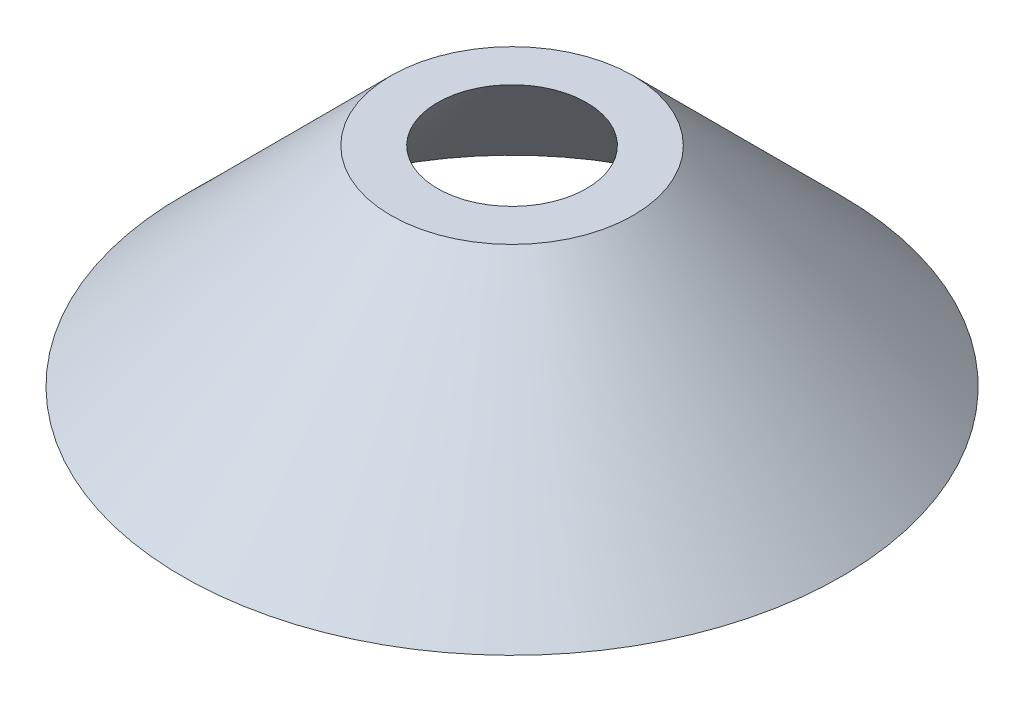
ISO-10303-21;
HEADER;
FILE_DESCRIPTION(('STEP AP214'),'2;1');
FILE_NAME('part.step','',(''),(''),'','','');
FILE_SCHEMA(('AUTOMOTIVE_DESIGN { 1 0 10303 214 1 1 1 1 }'));
ENDSEC;
DATA;
#1=APPLICATION_CONTEXT('core data for automotive mechanical design processes');
#2=APPLICATION_PROTOCOL_DEFINITION('international standard','automotive_design',2000,#1);
#3=PRODUCT_CONTEXT('',#1,'mechanical');
#4=PRODUCT('Part','Part','',(#3));
#5=PRODUCT_RELATED_PRODUCT_CATEGORY('part','',(#4));
#6=PRODUCT_DEFINITION_FORMATION('','',#4);
#7=PRODUCT_DEFINITION_CONTEXT('part definition',#1,'design');
#8=PRODUCT_DEFINITION('design','',#6,#7);
#9=PRODUCT_DEFINITION_SHAPE('','',#8);
#10=(LENGTH_UNIT() NAMED_UNIT(*) SI_UNIT(.MILLI.,.METRE.));
#11=(NAMED_UNIT(*) PLANE_ANGLE_UNIT() SI_UNIT($,.RADIAN.));
#12=(NAMED_UNIT(*) SI_UNIT($,.STERADIAN.) SOLID_ANGLE_UNIT());
#13=UNCERTAINTY_MEASURE_WITH_UNIT(LENGTH_MEASURE(1.E-05),#10,'distance_accuracy_value','');
#14=(GEOMETRIC_REPRESENTATION_CONTEXT(3) GLOBAL_UNCERTAINTY_ASSIGNED_CONTEXT((#13)) GLOBAL_UNIT_ASSIGNED_CONTEXT((#10,
#11,#12)) REPRESENTATION_CONTEXT('',''));
#15=CARTESIAN_POINT('',(0.,0.,0.));
#16=DIRECTION('',(0.,0.,1.));
#17=DIRECTION('',(1.,0.,0.));
#18=AXIS2_PLACEMENT_3D('',#15,#16,#17);
#19=CARTESIAN_POINT('',(-22.2620239326077,38.3144922249827,0.));
#20=DIRECTION('',(0.,-1.,0.));
#21=DIRECTION('',(0.,0.,-1.));
#22=AXIS2_PLACEMENT_3D('',#19,#20,#21);
#23=PLANE('',#22);
#24=CARTESIAN_POINT('',(0.,38.3144922249827,0.));
#25=DIRECTION('',(0.,-1.,0.));
#26=DIRECTION('',(0.,0.,-1.));
#27=AXIS2_PLACEMENT_3D('',#24,#25,#26);
#28=CIRCLE('',#27,22.2620239326077);
#29=CARTESIAN_POINT('',(0.,38.3144922249827,-22.2620239326077));
#30=VERTEX_POINT('',#29);
#31=EDGE_CURVE('E41',#30,#30,#28,.T.);
#32=ORIENTED_EDGE('',*,*,#31,.F.);
#33=EDGE_LOOP('',(#32));
#34=FACE_BOUND('',#33,.T.);
#35=CARTESIAN_POINT('',(0.,38.3144922249827,0.));
#36=DIRECTION('',(0.,-1.,0.));
#37=DIRECTION('',(0.,0.,-1.));
#38=AXIS2_PLACEMENT_3D('',#35,#36,#37);
#39=CIRCLE('',#38,13.6982071713148);
#40=CARTESIAN_POINT('',(0.,38.3144922249827,-13.6982071713148));
#41=VERTEX_POINT('',#40);
#42=EDGE_CURVE('E10',#41,#41,#39,.T.);
#43=ORIENTED_EDGE('',*,*,#42,.T.);
#44=EDGE_LOOP('',(#43));
#45=FACE_BOUND('',#44,.T.);
#46=ADVANCED_FACE('F27',(#34,#45),#23,.F.);
#47=CARTESIAN_POINT('',(0.,-5.92160260733617E-13,0.));
#48=DIRECTION('',(0.,-1.,0.));
#49=DIRECTION('',(0.,0.,-1.));
#50=AXIS2_PLACEMENT_3D('',#47,#48,#49);
#51=CONICAL_SURFACE('',#50,52.0126993962986,0.785398163397453);
#52=CARTESIAN_POINT('',(0.,-5.92160260733617E-13,0.));
#53=DIRECTION('',(0.,-1.,0.));
#54=DIRECTION('',(0.,0.,-1.));
#55=AXIS2_PLACEMENT_3D('',#52,#53,#54);
#56=CIRCLE('',#55,52.0126993962986);
#57=CARTESIAN_POINT('',(0.,-5.92160260750126E-13,-52.0126993962986));
#58=VERTEX_POINT('',#57);
#59=EDGE_CURVE('E33',#58,#58,#56,.T.);
#60=CARTESIAN_POINT('',(0.,38.3144922249827,-13.6982071713148));
#61=CARTESIAN_POINT('',(0.,37.9153829309725,-14.0973164653251));
#62=CARTESIAN_POINT('',(0.,37.5162736369622,-14.4964257593353));
#63=CARTESIAN_POINT('',(0.,36.7180550489417,-15.2946443473558));
#64=CARTESIAN_POINT('',(0.,36.3189457549315,-15.6937536413661));
#65=CARTESIAN_POINT('',(0.,35.520727166911,-16.4919722293866));
#66=CARTESIAN_POINT('',(0.,35.1216178729008,-16.8910815233968));
#67=CARTESIAN_POINT('',(0.,34.3233992848803,-17.6893001114173));
#68=CARTESIAN_POINT('',(0.,33.9242899908701,-18.0884094054276));
#69=CARTESIAN_POINT('',(0.,33.1260714028496,-18.8866279934481));
#70=CARTESIAN_POINT('',(0.,32.7269621088393,-19.2857372874583));
#71=CARTESIAN_POINT('',(0.,31.9287435208188,-20.0839558754788));
#72=CARTESIAN_POINT('',(0.,31.5296342268086,-20.483065169489));
#73=CARTESIAN_POINT('',(0.,30.7314156387881,-21.2812837575095));
#74=CARTESIAN_POINT('',(0.,30.3323063447779,-21.6803930515198));
#75=CARTESIAN_POINT('',(0.,29.5340877567574,-22.4786116395403));
#76=CARTESIAN_POINT('',(0.,29.1349784627471,-22.8777209335505));
#77=CARTESIAN_POINT('',(0.,28.3367598747267,-23.675939521571));
#78=CARTESIAN_POINT('',(0.,27.9376505807164,-24.0750488155813));
#79=CARTESIAN_POINT('',(0.,27.1394319926959,-24.8732674036018));
#80=CARTESIAN_POINT('',(0.,26.7403226986857,-25.272376697612));
#81=CARTESIAN_POINT('',(0.,25.9421041106652,-26.0705952856325));
#82=CARTESIAN_POINT('',(0.,25.542994816655,-26.4697045796427));
#83=CARTESIAN_POINT('',(0.,24.7447762286345,-27.2679231676632));
#84=CARTESIAN_POINT('',(0.,24.3456669346242,-27.6670324616735));
#85=CARTESIAN_POINT('',(0.,23.5474483466037,-28.465251049694));
#86=CARTESIAN_POINT('',(0.,23.1483390525935,-28.8643603437042));
#87=CARTESIAN_POINT('',(0.,22.350120464573,-29.6625789317247));
#88=CARTESIAN_POINT('',(0.,21.9510111705628,-30.061688225735));
#89=CARTESIAN_POINT('',(0.,21.1527925825423,-30.8599068137555));
#90=CARTESIAN_POINT('',(0.,20.753683288532,-31.2590161077657));
#91=CARTESIAN_POINT('',(0.,19.9554647005116,-32.0572346957862));
#92=CARTESIAN_POINT('',(0.,19.5563554065013,-32.4563439897965));
#93=CARTESIAN_POINT('',(0.,18.7581368184808,-33.2545625778169));
#94=CARTESIAN_POINT('',(0.,18.3590275244706,-33.6536718718272));
#95=CARTESIAN_POINT('',(0.,17.5608089364501,-34.4518904598477));
#96=CARTESIAN_POINT('',(0.,17.1616996424398,-34.8509997538579));
#97=CARTESIAN_POINT('',(0.,16.3634810544194,-35.6492183418784));
#98=CARTESIAN_POINT('',(0.,15.9643717604091,-36.0483276358887));
#99=CARTESIAN_POINT('',(0.,15.1661531723886,-36.8465462239092));
#100=CARTESIAN_POINT('',(0.,14.7670438783784,-37.2456555179194));
#101=CARTESIAN_POINT('',(0.,13.9688252903579,-38.0438741059399));
#102=CARTESIAN_POINT('',(0.,13.5697159963477,-38.4429833999502));
#103=CARTESIAN_POINT('',(0.,12.7714974083272,-39.2412019879707));
#104=CARTESIAN_POINT('',(0.,12.3723881143169,-39.6403112819809));
#105=CARTESIAN_POINT('',(0.,11.5741695262965,-40.4385298700014));
#106=CARTESIAN_POINT('',(0.,11.1750602322862,-40.8376391640116));
#107=CARTESIAN_POINT('',(0.,10.3768416442657,-41.6358577520321));
#108=CARTESIAN_POINT('',(0.,9.97773235025548,-42.0349670460424));
#109=CARTESIAN_POINT('',(0.,9.17951376223499,-42.8331856340629));
#110=CARTESIAN_POINT('',(0.,8.78040446822475,-43.2322949280731));
#111=CARTESIAN_POINT('',(0.,7.98218588020427,-44.0305135160936));
#112=CARTESIAN_POINT('',(0.,7.58307658619402,-44.4296228101039));
#113=CARTESIAN_POINT('',(0.,6.78485799817354,-45.2278413981244));
#114=CARTESIAN_POINT('',(0.,6.38574870416329,-45.6269506921346));
#115=CARTESIAN_POINT('',(0.,5.58753011614281,-46.4251692801551));
#116=CARTESIAN_POINT('',(0.,5.18842082213256,-46.8242785741653));
#117=CARTESIAN_POINT('',(0.,4.39020223411208,-47.6224971621858));
#118=CARTESIAN_POINT('',(0.,3.99109294010184,-48.0216064561961));
#119=CARTESIAN_POINT('',(0.,3.19287435208135,-48.8198250442166));
#120=CARTESIAN_POINT('',(0.,2.79376505807111,-49.2189343382268));
#121=CARTESIAN_POINT('',(0.,1.99554647005062,-50.0171529262473));
#122=CARTESIAN_POINT('',(0.,1.59643717604038,-50.4162622202576));
#123=CARTESIAN_POINT('',(0.,0.798218588019896,-51.2144808082781));
#124=CARTESIAN_POINT('',(0.,0.399109294009653,-51.6135901022883));
#125=CARTESIAN_POINT('',(0.,-5.92160260733617E-13,-52.0126993962986));
#126=B_SPLINE_CURVE_WITH_KNOTS('',3,(#60,#61,#62,#63,#64,#65,#66,#67,#68,#69,#70,#71,#72,#73,
#74,#75,#76,#77,#78,#79,#80,#81,#82,#83,#84,#85,#86,#87,#88,#89,#90,#91,#92,#93,#94,#95,#96,#97,
#98,#99,#100,#101,#102,#103,#104,#105,#106,#107,#108,#109,#110,#111,#112,#113,#114,#115,#116,
#117,#118,#119,#120,#121,#122,#123,#124,#125),.UNSPECIFIED.,.F.,.F.,(4,2,2,2,2,2,2,2,2,2,2,2,2,
2,2,2,2,2,2,2,2,2,2,2,2,2,2,2,2,2,2,2,4),(0.,1.69327732937532,3.38655465875064,5.07983198812596,
6.77310931750127,8.46638664687659,10.1596639762519,11.8529413056272,13.5462186350026,
15.2394959643779,16.9327732937532,18.6260506231285,20.3193279525038,22.0126052818791,
23.7058826112545,25.3991599406298,27.0924372700051,28.7857145993804,30.4789919287557,
32.1722692581311,33.8655465875064,35.5588239168817,37.252101246257,38.9453785756323,
40.6386559050077,42.331933234383,44.0252105637583,45.7184878931336,47.4117652225089,
49.1050425518843,50.7983198812596,52.4915972106349,54.1848745400102),.UNSPECIFIED.);
#127=EDGE_CURVE('BSEAM50',#41,#58,#126,.T.);
#128=ORIENTED_EDGE('',*,*,#42,.F.);
#129=ORIENTED_EDGE('',*,*,#59,.T.);
#130=ORIENTED_EDGE('',*,*,#127,.T.);
#131=ORIENTED_EDGE('',*,*,#127,.F.);
#132=EDGE_LOOP('',(#128,#130,#129,#131));
#133=FACE_BOUND('',#132,.T.);
#134=ADVANCED_FACE('F50',(#133),#51,.F.);
#135=CARTESIAN_POINT('',(-52.0126993962986,-4.92682669340742E-13,0.));
#136=DIRECTION('',(0.,1.,0.));
#137=DIRECTION('',(0.,0.,1.));
#138=AXIS2_PLACEMENT_3D('',#135,#136,#137);
#139=PLANE('',#138);
#140=ORIENTED_EDGE('',*,*,#59,.F.);
#141=EDGE_LOOP('',(#140));
#142=FACE_BOUND('',#141,.T.);
#143=CARTESIAN_POINT('',(0.,-3.93205077947866E-13,0.));
#144=DIRECTION('',(0.,-1.,0.));
#145=DIRECTION('',(0.,0.,-1.));
#146=AXIS2_PLACEMENT_3D('',#143,#144,#145);
#147=CIRCLE('',#146,60.5765161575915);
#148=CARTESIAN_POINT('',(0.,-3.93205077947866E-13,-60.5765161575915));
#149=VERTEX_POINT('',#148);
#150=EDGE_CURVE('E37',#149,#149,#147,.T.);
#151=ORIENTED_EDGE('',*,*,#150,.T.);
#152=EDGE_LOOP('',(#151));
#153=FACE_BOUND('',#152,.T.);
#154=ADVANCED_FACE('F54',(#142,#153),#139,.F.);
#155=CARTESIAN_POINT('',(0.,38.3144922249827,0.));
#156=DIRECTION('',(0.,-1.,0.));
#157=DIRECTION('',(0.,0.,-1.));
#158=AXIS2_PLACEMENT_3D('',#155,#156,#157);
#159=CONICAL_SURFACE('',#158,22.2620239326077,0.785398163397456);
#160=ORIENTED_EDGE('',*,*,#150,.F.);
#161=EDGE_LOOP('',(#160));
#162=FACE_BOUND('',#161,.T.);
#163=ORIENTED_EDGE('',*,*,#31,.T.);
#164=EDGE_LOOP('',(#163));
#165=FACE_BOUND('',#164,.T.);
#166=ADVANCED_FACE('F47',(#162,#165),#159,.T.);
#167=CLOSED_SHELL('',(#46,#134,#154,#166));
#168=MANIFOLD_SOLID_BREP('B2',#167);
#169=ADVANCED_BREP_SHAPE_REPRESENTATION('',(#18,#168),#14);
#170=SHAPE_DEFINITION_REPRESENTATION(#9,#169);
ENDSEC;
END-ISO-10303-21;
